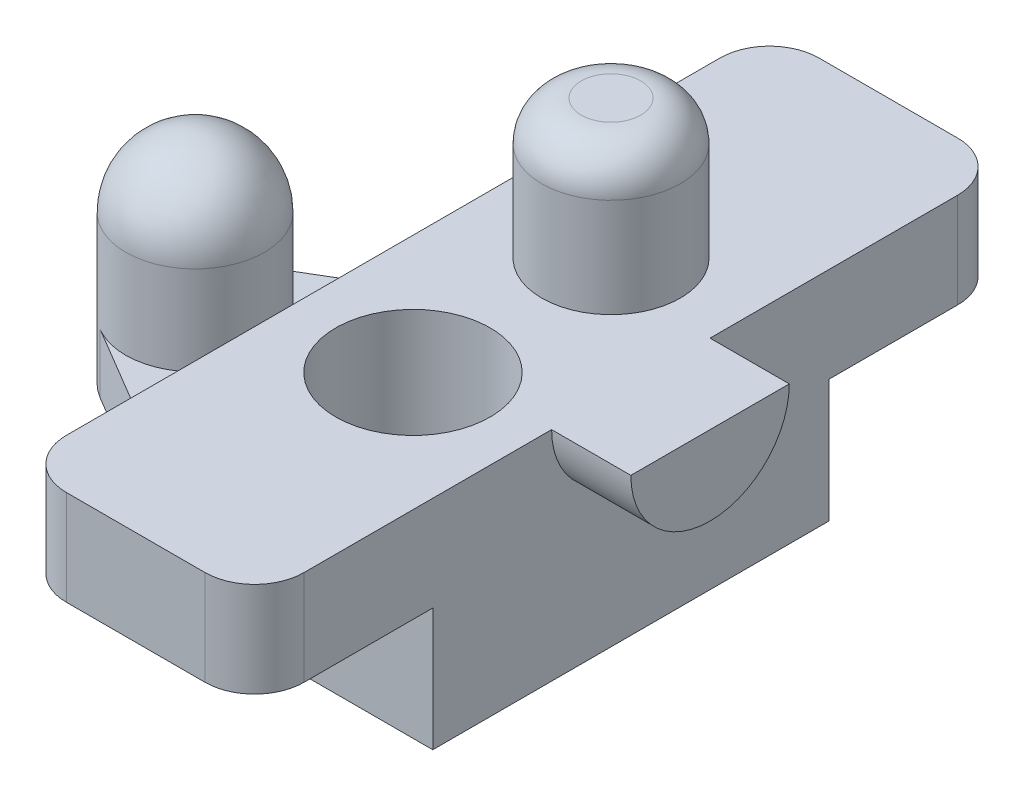
ISO-10303-21;
HEADER;
FILE_DESCRIPTION(('STEP AP214'),'2;1');
FILE_NAME('part.step','',(''),(''),'','','');
FILE_SCHEMA(('AUTOMOTIVE_DESIGN { 1 0 10303 214 1 1 1 1 }'));
ENDSEC;
DATA;
#1=APPLICATION_CONTEXT('core data for automotive mechanical design processes');
#2=APPLICATION_PROTOCOL_DEFINITION('international standard','automotive_design',2000,#1);
#3=PRODUCT_CONTEXT('',#1,'mechanical');
#4=PRODUCT('Part','Part','',(#3));
#5=PRODUCT_RELATED_PRODUCT_CATEGORY('part','',(#4));
#6=PRODUCT_DEFINITION_FORMATION('','',#4);
#7=PRODUCT_DEFINITION_CONTEXT('part definition',#1,'design');
#8=PRODUCT_DEFINITION('design','',#6,#7);
#9=PRODUCT_DEFINITION_SHAPE('','',#8);
#10=(LENGTH_UNIT() NAMED_UNIT(*) SI_UNIT(.MILLI.,.METRE.));
#11=(NAMED_UNIT(*) PLANE_ANGLE_UNIT() SI_UNIT($,.RADIAN.));
#12=(NAMED_UNIT(*) SI_UNIT($,.STERADIAN.) SOLID_ANGLE_UNIT());
#13=UNCERTAINTY_MEASURE_WITH_UNIT(LENGTH_MEASURE(1.E-05),#10,'distance_accuracy_value','');
#14=(GEOMETRIC_REPRESENTATION_CONTEXT(3) GLOBAL_UNCERTAINTY_ASSIGNED_CONTEXT((#13)) GLOBAL_UNIT_ASSIGNED_CONTEXT((#10,
#11,#12)) REPRESENTATION_CONTEXT('',''));
#15=CARTESIAN_POINT('',(0.,0.,0.));
#16=DIRECTION('',(0.,0.,1.));
#17=DIRECTION('',(1.,0.,0.));
#18=AXIS2_PLACEMENT_3D('',#15,#16,#17);
#19=CARTESIAN_POINT('',(11.,-1.5,-5.));
#20=DIRECTION('',(-1.,0.,0.));
#21=DIRECTION('',(0.,0.,1.));
#22=AXIS2_PLACEMENT_3D('',#19,#20,#21);
#23=PLANE('',#22);
#24=CARTESIAN_POINT('',(11.,4.,0.));
#25=DIRECTION('',(1.,0.,0.));
#26=DIRECTION('',(0.,0.,-1.));
#27=AXIS2_PLACEMENT_3D('',#24,#25,#26);
#28=CIRCLE('',#27,2.);
#29=CARTESIAN_POINT('',(11.,4.,2.));
#30=VERTEX_POINT('',#29);
#31=CARTESIAN_POINT('',(11.,4.,-2.));
#32=VERTEX_POINT('',#31);
#33=EDGE_CURVE('E59',#30,#32,#28,.T.);
#34=ORIENTED_EDGE('',*,*,#33,.F.);
#35=DIRECTION('',(0.,0.,-1.));
#36=VECTOR('',#35,1.);
#37=CARTESIAN_POINT('',(11.,4.,-5.));
#38=LINE('',#37,#36);
#39=CARTESIAN_POINT('',(11.,4.,8.25));
#40=VERTEX_POINT('',#39);
#41=EDGE_CURVE('E300',#40,#30,#38,.T.);
#42=ORIENTED_EDGE('',*,*,#41,.F.);
#43=DIRECTION('',(0.,1.,0.));
#44=VECTOR('',#43,1.);
#45=CARTESIAN_POINT('',(11.,1.6,8.25));
#46=LINE('',#45,#44);
#47=CARTESIAN_POINT('',(11.,1.6,8.25));
#48=VERTEX_POINT('',#47);
#49=EDGE_CURVE('E199',#48,#40,#46,.T.);
#50=ORIENTED_EDGE('',*,*,#49,.F.);
#51=DIRECTION('',(0.,0.,-1.));
#52=VECTOR('',#51,1.);
#53=CARTESIAN_POINT('',(11.,1.6,8.25));
#54=LINE('',#53,#52);
#55=CARTESIAN_POINT('',(11.,1.6,5.));
#56=VERTEX_POINT('',#55);
#57=EDGE_CURVE('E239',#48,#56,#54,.T.);
#58=ORIENTED_EDGE('',*,*,#57,.T.);
#59=DIRECTION('',(0.,1.,0.));
#60=VECTOR('',#59,1.);
#61=CARTESIAN_POINT('',(11.,-1.5,5.));
#62=LINE('',#61,#60);
#63=CARTESIAN_POINT('',(11.,-1.5,5.));
#64=VERTEX_POINT('',#63);
#65=EDGE_CURVE('E357',#64,#56,#62,.T.);
#66=ORIENTED_EDGE('',*,*,#65,.F.);
#67=DIRECTION('',(0.,0.,1.));
#68=VECTOR('',#67,1.);
#69=CARTESIAN_POINT('',(11.,-1.5,-5.));
#70=LINE('',#69,#68);
#71=CARTESIAN_POINT('',(11.,-1.5,-5.));
#72=VERTEX_POINT('',#71);
#73=EDGE_CURVE('E317',#72,#64,#70,.T.);
#74=ORIENTED_EDGE('',*,*,#73,.F.);
#75=DIRECTION('',(0.,1.,0.));
#76=VECTOR('',#75,1.);
#77=CARTESIAN_POINT('',(11.,-1.5,-5.));
#78=LINE('',#77,#76);
#79=CARTESIAN_POINT('',(11.,1.6,-5.));
#80=VERTEX_POINT('',#79);
#81=EDGE_CURVE('E361',#72,#80,#78,.T.);
#82=ORIENTED_EDGE('',*,*,#81,.T.);
#83=DIRECTION('',(0.,0.,-1.));
#84=VECTOR('',#83,1.);
#85=CARTESIAN_POINT('',(11.,1.6,-8.25));
#86=LINE('',#85,#84);
#87=CARTESIAN_POINT('',(11.,1.6,-8.25));
#88=VERTEX_POINT('',#87);
#89=EDGE_CURVE('E255',#80,#88,#86,.T.);
#90=ORIENTED_EDGE('',*,*,#89,.T.);
#91=DIRECTION('',(0.,1.,0.));
#92=VECTOR('',#91,1.);
#93=CARTESIAN_POINT('',(11.,1.6,-8.25));
#94=LINE('',#93,#92);
#95=CARTESIAN_POINT('',(11.,4.,-8.25));
#96=VERTEX_POINT('',#95);
#97=EDGE_CURVE('E271',#88,#96,#94,.T.);
#98=ORIENTED_EDGE('',*,*,#97,.T.);
#99=EDGE_CURVE('E299',#32,#96,#38,.T.);
#100=ORIENTED_EDGE('',*,*,#99,.F.);
#101=EDGE_LOOP('',(#34,#42,#50,#58,#66,#74,#82,#90,#98,#100));
#102=FACE_BOUND('',#101,.T.);
#103=ADVANCED_FACE('F43',(#102),#23,.F.);
#104=CARTESIAN_POINT('',(5.,-1.5,-5.));
#105=DIRECTION('',(0.,0.,1.));
#106=DIRECTION('',(1.,0.,0.));
#107=AXIS2_PLACEMENT_3D('',#104,#105,#106);
#108=PLANE('',#107);
#109=DIRECTION('',(0.,-1.,0.));
#110=VECTOR('',#109,1.);
#111=CARTESIAN_POINT('',(5.,4.,-5.));
#112=LINE('',#111,#110);
#113=CARTESIAN_POINT('',(5.,1.6,-5.));
#114=VERTEX_POINT('',#113);
#115=CARTESIAN_POINT('',(5.,0.,-5.));
#116=VERTEX_POINT('',#115);
#117=EDGE_CURVE('E303',#114,#116,#112,.T.);
#118=ORIENTED_EDGE('',*,*,#117,.F.);
#119=DIRECTION('',(1.,0.,0.));
#120=VECTOR('',#119,1.);
#121=CARTESIAN_POINT('',(5.,1.6,-5.));
#122=LINE('',#121,#120);
#123=EDGE_CURVE('E250',#114,#80,#122,.T.);
#124=ORIENTED_EDGE('',*,*,#123,.T.);
#125=ORIENTED_EDGE('',*,*,#81,.F.);
#126=DIRECTION('',(1.,0.,0.));
#127=VECTOR('',#126,1.);
#128=CARTESIAN_POINT('',(5.,-1.5,-5.));
#129=LINE('',#128,#127);
#130=CARTESIAN_POINT('',(5.,-1.5,-5.));
#131=VERTEX_POINT('',#130);
#132=EDGE_CURVE('E313',#131,#72,#129,.T.);
#133=ORIENTED_EDGE('',*,*,#132,.F.);
#134=DIRECTION('',(0.,1.,0.));
#135=VECTOR('',#134,1.);
#136=CARTESIAN_POINT('',(5.,-1.5,-5.));
#137=LINE('',#136,#135);
#138=EDGE_CURVE('E335',#131,#116,#137,.T.);
#139=ORIENTED_EDGE('',*,*,#138,.T.);
#140=EDGE_LOOP('',(#118,#124,#125,#133,#139));
#141=FACE_BOUND('',#140,.T.);
#142=ADVANCED_FACE('F391',(#141),#108,.F.);
#143=CARTESIAN_POINT('',(11.,-1.5,5.));
#144=DIRECTION('',(0.,0.,-1.));
#145=DIRECTION('',(-1.,0.,0.));
#146=AXIS2_PLACEMENT_3D('',#143,#144,#145);
#147=PLANE('',#146);
#148=ORIENTED_EDGE('',*,*,#65,.T.);
#149=DIRECTION('',(-1.,0.,0.));
#150=VECTOR('',#149,1.);
#151=CARTESIAN_POINT('',(5.,1.6,5.));
#152=LINE('',#151,#150);
#153=CARTESIAN_POINT('',(5.,1.6,5.));
#154=VERTEX_POINT('',#153);
#155=EDGE_CURVE('E236',#56,#154,#152,.T.);
#156=ORIENTED_EDGE('',*,*,#155,.T.);
#157=DIRECTION('',(0.,-1.,0.));
#158=VECTOR('',#157,1.);
#159=CARTESIAN_POINT('',(5.,4.,5.));
#160=LINE('',#159,#158);
#161=CARTESIAN_POINT('',(5.,0.,5.));
#162=VERTEX_POINT('',#161);
#163=EDGE_CURVE('E309',#154,#162,#160,.T.);
#164=ORIENTED_EDGE('',*,*,#163,.T.);
#165=DIRECTION('',(0.,1.,0.));
#166=VECTOR('',#165,1.);
#167=CARTESIAN_POINT('',(5.,-1.5,5.));
#168=LINE('',#167,#166);
#169=CARTESIAN_POINT('',(5.,-1.5,5.));
#170=VERTEX_POINT('',#169);
#171=EDGE_CURVE('E353',#170,#162,#168,.T.);
#172=ORIENTED_EDGE('',*,*,#171,.F.);
#173=DIRECTION('',(-1.,0.,0.));
#174=VECTOR('',#173,1.);
#175=CARTESIAN_POINT('',(11.,-1.5,5.));
#176=LINE('',#175,#174);
#177=EDGE_CURVE('E321',#64,#170,#176,.T.);
#178=ORIENTED_EDGE('',*,*,#177,.F.);
#179=EDGE_LOOP('',(#148,#156,#164,#172,#178));
#180=FACE_BOUND('',#179,.T.);
#181=ADVANCED_FACE('F397',(#180),#147,.F.);
#182=CARTESIAN_POINT('',(5.,-1.5,5.));
#183=DIRECTION('',(0.510109480302236,0.,-0.860109480302236));
#184=DIRECTION('',(-0.860109480302236,0.,-0.510109480302236));
#185=AXIS2_PLACEMENT_3D('',#182,#183,#184);
#186=PLANE('',#185);
#187=DIRECTION('',(-0.860109480302236,0.,-0.510109480302236));
#188=VECTOR('',#187,1.);
#189=CARTESIAN_POINT('',(5.,0.,5.));
#190=LINE('',#189,#188);
#191=CARTESIAN_POINT('',(-0.892691590528913,0.,1.50519159052891));
#192=VERTEX_POINT('',#191);
#193=EDGE_CURVE('E312',#162,#192,#190,.T.);
#194=ORIENTED_EDGE('',*,*,#193,.T.);
#195=DIRECTION('',(0.,1.,0.));
#196=VECTOR('',#195,1.);
#197=CARTESIAN_POINT('',(-0.892691590528913,-1.5,1.50519159052891));
#198=LINE('',#197,#196);
#199=CARTESIAN_POINT('',(-0.892691590528913,-1.5,1.50519159052891));
#200=VERTEX_POINT('',#199);
#201=EDGE_CURVE('E349',#200,#192,#198,.T.);
#202=ORIENTED_EDGE('',*,*,#201,.F.);
#203=DIRECTION('',(-0.860109480302236,0.,-0.510109480302236));
#204=VECTOR('',#203,1.);
#205=CARTESIAN_POINT('',(5.,-1.5,5.));
#206=LINE('',#205,#204);
#207=EDGE_CURVE('E324',#170,#200,#206,.T.);
#208=ORIENTED_EDGE('',*,*,#207,.F.);
#209=ORIENTED_EDGE('',*,*,#171,.T.);
#210=EDGE_LOOP('',(#194,#202,#208,#209));
#211=FACE_BOUND('',#210,.T.);
#212=ADVANCED_FACE('F420',(#211),#186,.F.);
#213=CARTESIAN_POINT('',(0.,-1.5,0.));
#214=DIRECTION('',(0.,1.,0.));
#215=DIRECTION('',(0.,0.,1.));
#216=AXIS2_PLACEMENT_3D('',#213,#214,#215);
#217=CYLINDRICAL_SURFACE('',#216,1.75);
#218=CARTESIAN_POINT('',(0.,2.25,0.));
#219=DIRECTION('',(0.,1.,0.));
#220=DIRECTION('',(0.,0.,1.));
#221=AXIS2_PLACEMENT_3D('',#218,#219,#220);
#222=CIRCLE('',#221,1.75);
#223=CARTESIAN_POINT('',(0.,2.25,1.75));
#224=VERTEX_POINT('',#223);
#225=EDGE_CURVE('E368',#224,#224,#222,.F.);
#226=ORIENTED_EDGE('',*,*,#225,.T.);
#227=EDGE_LOOP('',(#226));
#228=FACE_BOUND('',#227,.T.);
#229=ORIENTED_EDGE('',*,*,#201,.T.);
#230=CARTESIAN_POINT('',(0.,0.,0.));
#231=DIRECTION('',(0.,1.,0.));
#232=DIRECTION('',(0.,0.,1.));
#233=AXIS2_PLACEMENT_3D('',#230,#231,#232);
#234=CIRCLE('',#233,1.75);
#235=CARTESIAN_POINT('',(-0.892691590528913,0.,-1.50519159052891));
#236=VERTEX_POINT('',#235);
#237=EDGE_CURVE('E365',#236,#192,#234,.F.);
#238=ORIENTED_EDGE('',*,*,#237,.F.);
#239=DIRECTION('',(0.,1.,0.));
#240=VECTOR('',#239,1.);
#241=CARTESIAN_POINT('',(-0.892691590528913,-1.5,-1.50519159052891));
#242=LINE('',#241,#240);
#243=CARTESIAN_POINT('',(-0.892691590528913,-1.5,-1.50519159052891));
#244=VERTEX_POINT('',#243);
#245=EDGE_CURVE('E345',#244,#236,#242,.T.);
#246=ORIENTED_EDGE('',*,*,#245,.F.);
#247=CARTESIAN_POINT('',(0.,-1.5,0.));
#248=DIRECTION('',(0.,1.,0.));
#249=DIRECTION('',(0.,0.,1.));
#250=AXIS2_PLACEMENT_3D('',#247,#248,#249);
#251=CIRCLE('',#250,1.75);
#252=EDGE_CURVE('E327',#244,#200,#251,.T.);
#253=ORIENTED_EDGE('',*,*,#252,.T.);
#254=EDGE_LOOP('',(#229,#238,#246,#253));
#255=FACE_BOUND('',#254,.T.);
#256=ADVANCED_FACE('F416',(#228,#255),#217,.T.);
#257=CARTESIAN_POINT('',(5.,-1.5,-5.));
#258=DIRECTION('',(-0.510109480302236,0.,-0.860109480302236));
#259=DIRECTION('',(-0.860109480302236,0.,0.510109480302236));
#260=AXIS2_PLACEMENT_3D('',#257,#258,#259);
#261=PLANE('',#260);
#262=DIRECTION('',(-0.860109480302236,0.,0.510109480302236));
#263=VECTOR('',#262,1.);
#264=CARTESIAN_POINT('',(5.,0.,-5.));
#265=LINE('',#264,#263);
#266=EDGE_CURVE('E318',#116,#236,#265,.T.);
#267=ORIENTED_EDGE('',*,*,#266,.F.);
#268=ORIENTED_EDGE('',*,*,#138,.F.);
#269=DIRECTION('',(-0.860109480302236,0.,0.510109480302236));
#270=VECTOR('',#269,1.);
#271=CARTESIAN_POINT('',(5.,-1.5,-5.));
#272=LINE('',#271,#270);
#273=EDGE_CURVE('E331',#131,#244,#272,.T.);
#274=ORIENTED_EDGE('',*,*,#273,.T.);
#275=ORIENTED_EDGE('',*,*,#245,.T.);
#276=EDGE_LOOP('',(#267,#268,#274,#275));
#277=FACE_BOUND('',#276,.T.);
#278=ADVANCED_FACE('F419',(#277),#261,.T.);
#279=CARTESIAN_POINT('',(0.,-1.5,0.));
#280=DIRECTION('',(0.,1.,0.));
#281=DIRECTION('',(0.,0.,1.));
#282=AXIS2_PLACEMENT_3D('',#279,#280,#281);
#283=PLANE('',#282);
#284=ORIENTED_EDGE('',*,*,#132,.T.);
#285=ORIENTED_EDGE('',*,*,#73,.T.);
#286=ORIENTED_EDGE('',*,*,#177,.T.);
#287=ORIENTED_EDGE('',*,*,#207,.T.);
#288=ORIENTED_EDGE('',*,*,#252,.F.);
#289=ORIENTED_EDGE('',*,*,#273,.F.);
#290=EDGE_LOOP('',(#284,#285,#286,#287,#288,#289));
#291=FACE_BOUND('',#290,.T.);
#292=ADVANCED_FACE('F436',(#291),#283,.F.);
#293=CARTESIAN_POINT('',(0.,0.,0.));
#294=DIRECTION('',(0.,1.,0.));
#295=DIRECTION('',(0.,0.,1.));
#296=AXIS2_PLACEMENT_3D('',#293,#294,#295);
#297=PLANE('',#296);
#298=ORIENTED_EDGE('',*,*,#266,.T.);
#299=ORIENTED_EDGE('',*,*,#237,.T.);
#300=ORIENTED_EDGE('',*,*,#193,.F.);
#301=DIRECTION('',(0.,0.,1.));
#302=VECTOR('',#301,1.);
#303=CARTESIAN_POINT('',(5.,0.,-5.));
#304=LINE('',#303,#302);
#305=EDGE_CURVE('E286',#116,#162,#304,.T.);
#306=ORIENTED_EDGE('',*,*,#305,.F.);
#307=EDGE_LOOP('',(#298,#299,#300,#306));
#308=FACE_BOUND('',#307,.T.);
#309=ADVANCED_FACE('F430',(#308),#297,.T.);
#310=CARTESIAN_POINT('',(5.,4.,-5.));
#311=DIRECTION('',(1.,0.,0.));
#312=DIRECTION('',(0.,0.,-1.));
#313=AXIS2_PLACEMENT_3D('',#310,#311,#312);
#314=PLANE('',#313);
#315=ORIENTED_EDGE('',*,*,#305,.T.);
#316=ORIENTED_EDGE('',*,*,#163,.F.);
#317=DIRECTION('',(0.,0.,1.));
#318=VECTOR('',#317,1.);
#319=CARTESIAN_POINT('',(5.,1.6,5.));
#320=LINE('',#319,#318);
#321=CARTESIAN_POINT('',(5.,1.6,8.24999999999999));
#322=VERTEX_POINT('',#321);
#323=EDGE_CURVE('E67',#154,#322,#320,.T.);
#324=ORIENTED_EDGE('',*,*,#323,.T.);
#325=DIRECTION('',(0.,1.,0.));
#326=VECTOR('',#325,1.);
#327=CARTESIAN_POINT('',(5.,1.6,8.24999999999999));
#328=LINE('',#327,#326);
#329=CARTESIAN_POINT('',(5.,4.,8.24999999999999));
#330=VERTEX_POINT('',#329);
#331=EDGE_CURVE('E204',#322,#330,#328,.T.);
#332=ORIENTED_EDGE('',*,*,#331,.T.);
#333=DIRECTION('',(0.,0.,1.));
#334=VECTOR('',#333,1.);
#335=CARTESIAN_POINT('',(5.,4.,-5.));
#336=LINE('',#335,#334);
#337=CARTESIAN_POINT('',(5.,4.,-8.24999999999999));
#338=VERTEX_POINT('',#337);
#339=EDGE_CURVE('E296',#338,#330,#336,.T.);
#340=ORIENTED_EDGE('',*,*,#339,.F.);
#341=DIRECTION('',(0.,1.,0.));
#342=VECTOR('',#341,1.);
#343=CARTESIAN_POINT('',(5.,1.6,-8.24999999999999));
#344=LINE('',#343,#342);
#345=CARTESIAN_POINT('',(5.,1.6,-8.24999999999999));
#346=VERTEX_POINT('',#345);
#347=EDGE_CURVE('E282',#346,#338,#344,.T.);
#348=ORIENTED_EDGE('',*,*,#347,.F.);
#349=DIRECTION('',(0.,0.,1.));
#350=VECTOR('',#349,1.);
#351=CARTESIAN_POINT('',(5.,1.6,-5.));
#352=LINE('',#351,#350);
#353=EDGE_CURVE('E246',#346,#114,#352,.T.);
#354=ORIENTED_EDGE('',*,*,#353,.T.);
#355=ORIENTED_EDGE('',*,*,#117,.T.);
#356=EDGE_LOOP('',(#315,#316,#324,#332,#340,#348,#354,#355));
#357=FACE_BOUND('',#356,.T.);
#358=ADVANCED_FACE('F442',(#357),#314,.F.);
#359=CARTESIAN_POINT('',(0.,4.,0.));
#360=DIRECTION('',(0.,1.,0.));
#361=DIRECTION('',(0.,0.,1.));
#362=AXIS2_PLACEMENT_3D('',#359,#360,#361);
#363=PLANE('',#362);
#364=CARTESIAN_POINT('',(8.,4.,2.5));
#365=DIRECTION('',(0.,1.,0.));
#366=DIRECTION('',(0.,0.,1.));
#367=AXIS2_PLACEMENT_3D('',#364,#365,#366);
#368=CIRCLE('',#367,1.95);
#369=CARTESIAN_POINT('',(8.,4.,4.45));
#370=VERTEX_POINT('',#369);
#371=EDGE_CURVE('E181',#370,#370,#368,.T.);
#372=ORIENTED_EDGE('',*,*,#371,.F.);
#373=EDGE_LOOP('',(#372));
#374=FACE_BOUND('',#373,.T.);
#375=CARTESIAN_POINT('',(8.,4.,-2.5));
#376=DIRECTION('',(0.,1.,0.));
#377=DIRECTION('',(0.,0.,1.));
#378=AXIS2_PLACEMENT_3D('',#375,#376,#377);
#379=CIRCLE('',#378,1.75);
#380=CARTESIAN_POINT('',(8.,4.,-0.75));
#381=VERTEX_POINT('',#380);
#382=EDGE_CURVE('E193',#381,#381,#379,.T.);
#383=ORIENTED_EDGE('',*,*,#382,.F.);
#384=EDGE_LOOP('',(#383));
#385=FACE_BOUND('',#384,.T.);
#386=ORIENTED_EDGE('',*,*,#339,.T.);
#387=CARTESIAN_POINT('',(6.25,4.,8.25));
#388=DIRECTION('',(0.,1.,0.));
#389=DIRECTION('',(0.,0.,1.));
#390=AXIS2_PLACEMENT_3D('',#387,#388,#389);
#391=CIRCLE('',#390,1.25);
#392=CARTESIAN_POINT('',(6.25,4.,9.5));
#393=VERTEX_POINT('',#392);
#394=EDGE_CURVE('E217',#330,#393,#391,.T.);
#395=ORIENTED_EDGE('',*,*,#394,.T.);
#396=DIRECTION('',(1.,0.,0.));
#397=VECTOR('',#396,1.);
#398=CARTESIAN_POINT('',(6.25000000000001,4.,9.5));
#399=LINE('',#398,#397);
#400=CARTESIAN_POINT('',(9.75,4.,9.5));
#401=VERTEX_POINT('',#400);
#402=EDGE_CURVE('E213',#393,#401,#399,.T.);
#403=ORIENTED_EDGE('',*,*,#402,.T.);
#404=CARTESIAN_POINT('',(9.75,4.,8.25));
#405=DIRECTION('',(0.,1.,0.));
#406=DIRECTION('',(0.,0.,-1.));
#407=AXIS2_PLACEMENT_3D('',#404,#405,#406);
#408=CIRCLE('',#407,1.25);
#409=EDGE_CURVE('E222',#401,#40,#408,.T.);
#410=ORIENTED_EDGE('',*,*,#409,.T.);
#411=ORIENTED_EDGE('',*,*,#41,.T.);
#412=DIRECTION('',(-1.,0.,0.));
#413=VECTOR('',#412,1.);
#414=CARTESIAN_POINT('',(13.,4.,2.));
#415=LINE('',#414,#413);
#416=CARTESIAN_POINT('',(13.,4.,2.));
#417=VERTEX_POINT('',#416);
#418=EDGE_CURVE('E170',#417,#30,#415,.T.);
#419=ORIENTED_EDGE('',*,*,#418,.F.);
#420=DIRECTION('',(0.,0.,1.));
#421=VECTOR('',#420,1.);
#422=CARTESIAN_POINT('',(13.,4.,2.));
#423=LINE('',#422,#421);
#424=CARTESIAN_POINT('',(13.,4.,-2.));
#425=VERTEX_POINT('',#424);
#426=EDGE_CURVE('E164',#425,#417,#423,.T.);
#427=ORIENTED_EDGE('',*,*,#426,.F.);
#428=DIRECTION('',(-1.,0.,0.));
#429=VECTOR('',#428,1.);
#430=CARTESIAN_POINT('',(13.,4.,-2.));
#431=LINE('',#430,#429);
#432=EDGE_CURVE('E167',#425,#32,#431,.T.);
#433=ORIENTED_EDGE('',*,*,#432,.T.);
#434=ORIENTED_EDGE('',*,*,#99,.T.);
#435=CARTESIAN_POINT('',(9.75,4.,-8.25));
#436=DIRECTION('',(0.,1.,0.));
#437=DIRECTION('',(0.,0.,1.));
#438=AXIS2_PLACEMENT_3D('',#435,#436,#437);
#439=CIRCLE('',#438,1.25);
#440=CARTESIAN_POINT('',(9.75,4.,-9.5));
#441=VERTEX_POINT('',#440);
#442=EDGE_CURVE('E226',#96,#441,#439,.T.);
#443=ORIENTED_EDGE('',*,*,#442,.T.);
#444=DIRECTION('',(-1.,0.,0.));
#445=VECTOR('',#444,1.);
#446=CARTESIAN_POINT('',(6.25000000000001,4.,-9.5));
#447=LINE('',#446,#445);
#448=CARTESIAN_POINT('',(6.25000000000001,4.,-9.5));
#449=VERTEX_POINT('',#448);
#450=EDGE_CURVE('E275',#441,#449,#447,.T.);
#451=ORIENTED_EDGE('',*,*,#450,.T.);
#452=CARTESIAN_POINT('',(6.25,4.,-8.25));
#453=DIRECTION('',(0.,1.,0.));
#454=DIRECTION('',(0.,0.,-1.));
#455=AXIS2_PLACEMENT_3D('',#452,#453,#454);
#456=CIRCLE('',#455,1.25);
#457=EDGE_CURVE('E251',#449,#338,#456,.T.);
#458=ORIENTED_EDGE('',*,*,#457,.T.);
#459=EDGE_LOOP('',(#386,#395,#403,#410,#411,#419,#427,#433,#434,#443,#451,#458));
#460=FACE_BOUND('',#459,.T.);
#461=ADVANCED_FACE('F166',(#374,#385,#460),#363,.T.);
#462=CARTESIAN_POINT('',(6.25,1.6,-8.25));
#463=DIRECTION('',(0.,1.,0.));
#464=DIRECTION('',(0.,0.,1.));
#465=AXIS2_PLACEMENT_3D('',#462,#463,#464);
#466=CYLINDRICAL_SURFACE('',#465,1.25);
#467=ORIENTED_EDGE('',*,*,#457,.F.);
#468=DIRECTION('',(0.,1.,0.));
#469=VECTOR('',#468,1.);
#470=CARTESIAN_POINT('',(6.25000000000001,1.6,-9.5));
#471=LINE('',#470,#469);
#472=CARTESIAN_POINT('',(6.25000000000001,1.6,-9.5));
#473=VERTEX_POINT('',#472);
#474=EDGE_CURVE('E287',#473,#449,#471,.T.);
#475=ORIENTED_EDGE('',*,*,#474,.F.);
#476=CARTESIAN_POINT('',(6.25,1.6,-8.25));
#477=DIRECTION('',(0.,1.,0.));
#478=DIRECTION('',(0.,0.,-1.));
#479=AXIS2_PLACEMENT_3D('',#476,#477,#478);
#480=CIRCLE('',#479,1.25);
#481=EDGE_CURVE('E267',#473,#346,#480,.T.);
#482=ORIENTED_EDGE('',*,*,#481,.T.);
#483=ORIENTED_EDGE('',*,*,#347,.T.);
#484=EDGE_LOOP('',(#467,#475,#482,#483));
#485=FACE_BOUND('',#484,.T.);
#486=ADVANCED_FACE('F459',(#485),#466,.T.);
#487=CARTESIAN_POINT('',(6.25000000000001,1.6,-9.5));
#488=DIRECTION('',(0.,0.,-1.));
#489=DIRECTION('',(-1.,0.,0.));
#490=AXIS2_PLACEMENT_3D('',#487,#488,#489);
#491=PLANE('',#490);
#492=ORIENTED_EDGE('',*,*,#450,.F.);
#493=DIRECTION('',(0.,1.,0.));
#494=VECTOR('',#493,1.);
#495=CARTESIAN_POINT('',(9.75,1.6,-9.5));
#496=LINE('',#495,#494);
#497=CARTESIAN_POINT('',(9.75,1.6,-9.5));
#498=VERTEX_POINT('',#497);
#499=EDGE_CURVE('E290',#498,#441,#496,.T.);
#500=ORIENTED_EDGE('',*,*,#499,.F.);
#501=DIRECTION('',(-1.,0.,0.));
#502=VECTOR('',#501,1.);
#503=CARTESIAN_POINT('',(6.25000000000001,1.6,-9.5));
#504=LINE('',#503,#502);
#505=EDGE_CURVE('E263',#498,#473,#504,.T.);
#506=ORIENTED_EDGE('',*,*,#505,.T.);
#507=ORIENTED_EDGE('',*,*,#474,.T.);
#508=EDGE_LOOP('',(#492,#500,#506,#507));
#509=FACE_BOUND('',#508,.T.);
#510=ADVANCED_FACE('F464',(#509),#491,.T.);
#511=CARTESIAN_POINT('',(9.75,1.6,-8.25));
#512=DIRECTION('',(0.,1.,0.));
#513=DIRECTION('',(0.,0.,1.));
#514=AXIS2_PLACEMENT_3D('',#511,#512,#513);
#515=CYLINDRICAL_SURFACE('',#514,1.25);
#516=ORIENTED_EDGE('',*,*,#442,.F.);
#517=ORIENTED_EDGE('',*,*,#97,.F.);
#518=CARTESIAN_POINT('',(9.75,1.6,-8.25));
#519=DIRECTION('',(0.,1.,0.));
#520=DIRECTION('',(0.,0.,1.));
#521=AXIS2_PLACEMENT_3D('',#518,#519,#520);
#522=CIRCLE('',#521,1.25);
#523=EDGE_CURVE('E259',#88,#498,#522,.T.);
#524=ORIENTED_EDGE('',*,*,#523,.T.);
#525=ORIENTED_EDGE('',*,*,#499,.T.);
#526=EDGE_LOOP('',(#516,#517,#524,#525));
#527=FACE_BOUND('',#526,.T.);
#528=ADVANCED_FACE('F470',(#527),#515,.T.);
#529=CARTESIAN_POINT('',(6.25,1.6,-8.25));
#530=DIRECTION('',(0.,-1.,0.));
#531=DIRECTION('',(0.,0.,-1.));
#532=AXIS2_PLACEMENT_3D('',#529,#530,#531);
#533=PLANE('',#532);
#534=ORIENTED_EDGE('',*,*,#353,.F.);
#535=ORIENTED_EDGE('',*,*,#481,.F.);
#536=ORIENTED_EDGE('',*,*,#505,.F.);
#537=ORIENTED_EDGE('',*,*,#523,.F.);
#538=ORIENTED_EDGE('',*,*,#89,.F.);
#539=ORIENTED_EDGE('',*,*,#123,.F.);
#540=EDGE_LOOP('',(#534,#535,#536,#537,#538,#539));
#541=FACE_BOUND('',#540,.T.);
#542=ADVANCED_FACE('F468',(#541),#533,.T.);
#543=CARTESIAN_POINT('',(9.75,1.6,8.25));
#544=DIRECTION('',(0.,1.,0.));
#545=DIRECTION('',(0.,0.,1.));
#546=AXIS2_PLACEMENT_3D('',#543,#544,#545);
#547=CYLINDRICAL_SURFACE('',#546,1.25);
#548=ORIENTED_EDGE('',*,*,#409,.F.);
#549=DIRECTION('',(0.,1.,0.));
#550=VECTOR('',#549,1.);
#551=CARTESIAN_POINT('',(9.75,1.6,9.5));
#552=LINE('',#551,#550);
#553=CARTESIAN_POINT('',(9.75,1.6,9.5));
#554=VERTEX_POINT('',#553);
#555=EDGE_CURVE('E198',#554,#401,#552,.T.);
#556=ORIENTED_EDGE('',*,*,#555,.F.);
#557=CARTESIAN_POINT('',(9.75,1.6,8.25));
#558=DIRECTION('',(0.,1.,0.));
#559=DIRECTION('',(0.,0.,-1.));
#560=AXIS2_PLACEMENT_3D('',#557,#558,#559);
#561=CIRCLE('',#560,1.25);
#562=EDGE_CURVE('E218',#554,#48,#561,.T.);
#563=ORIENTED_EDGE('',*,*,#562,.T.);
#564=ORIENTED_EDGE('',*,*,#49,.T.);
#565=EDGE_LOOP('',(#548,#556,#563,#564));
#566=FACE_BOUND('',#565,.T.);
#567=ADVANCED_FACE('F451',(#566),#547,.T.);
#568=CARTESIAN_POINT('',(6.25000000000001,1.6,9.5));
#569=DIRECTION('',(0.,0.,1.));
#570=DIRECTION('',(1.,0.,0.));
#571=AXIS2_PLACEMENT_3D('',#568,#569,#570);
#572=PLANE('',#571);
#573=ORIENTED_EDGE('',*,*,#402,.F.);
#574=DIRECTION('',(0.,1.,0.));
#575=VECTOR('',#574,1.);
#576=CARTESIAN_POINT('',(6.25,1.6,9.5));
#577=LINE('',#576,#575);
#578=CARTESIAN_POINT('',(6.25,1.6,9.5));
#579=VERTEX_POINT('',#578);
#580=EDGE_CURVE('E208',#579,#393,#577,.T.);
#581=ORIENTED_EDGE('',*,*,#580,.F.);
#582=DIRECTION('',(1.,0.,0.));
#583=VECTOR('',#582,1.);
#584=CARTESIAN_POINT('',(6.25000000000001,1.6,9.5));
#585=LINE('',#584,#583);
#586=EDGE_CURVE('E203',#579,#554,#585,.T.);
#587=ORIENTED_EDGE('',*,*,#586,.T.);
#588=ORIENTED_EDGE('',*,*,#555,.T.);
#589=EDGE_LOOP('',(#573,#581,#587,#588));
#590=FACE_BOUND('',#589,.T.);
#591=ADVANCED_FACE('F454',(#590),#572,.T.);
#592=CARTESIAN_POINT('',(6.25,1.6,8.25));
#593=DIRECTION('',(0.,1.,0.));
#594=DIRECTION('',(0.,0.,1.));
#595=AXIS2_PLACEMENT_3D('',#592,#593,#594);
#596=CYLINDRICAL_SURFACE('',#595,1.25);
#597=ORIENTED_EDGE('',*,*,#394,.F.);
#598=ORIENTED_EDGE('',*,*,#331,.F.);
#599=CARTESIAN_POINT('',(6.25,1.6,8.25));
#600=DIRECTION('',(0.,1.,0.));
#601=DIRECTION('',(0.,0.,1.));
#602=AXIS2_PLACEMENT_3D('',#599,#600,#601);
#603=CIRCLE('',#602,1.25);
#604=EDGE_CURVE('E230',#322,#579,#603,.T.);
#605=ORIENTED_EDGE('',*,*,#604,.T.);
#606=ORIENTED_EDGE('',*,*,#580,.T.);
#607=EDGE_LOOP('',(#597,#598,#605,#606));
#608=FACE_BOUND('',#607,.T.);
#609=ADVANCED_FACE('F412',(#608),#596,.T.);
#610=CARTESIAN_POINT('',(9.75,1.6,8.25));
#611=DIRECTION('',(0.,-1.,0.));
#612=DIRECTION('',(0.,0.,-1.));
#613=AXIS2_PLACEMENT_3D('',#610,#611,#612);
#614=PLANE('',#613);
#615=ORIENTED_EDGE('',*,*,#562,.F.);
#616=ORIENTED_EDGE('',*,*,#586,.F.);
#617=ORIENTED_EDGE('',*,*,#604,.F.);
#618=ORIENTED_EDGE('',*,*,#323,.F.);
#619=ORIENTED_EDGE('',*,*,#155,.F.);
#620=ORIENTED_EDGE('',*,*,#57,.F.);
#621=EDGE_LOOP('',(#615,#616,#617,#618,#619,#620));
#622=FACE_BOUND('',#621,.T.);
#623=ADVANCED_FACE('F404',(#622),#614,.T.);
#624=CARTESIAN_POINT('',(0.,2.25,0.));
#625=DIRECTION('',(0.,1.,0.));
#626=DIRECTION('',(0.,0.,1.));
#627=AXIS2_PLACEMENT_3D('',#624,#625,#626);
#628=SPHERICAL_SURFACE('',#627,1.75);
#629=ORIENTED_EDGE('',*,*,#225,.F.);
#630=EDGE_LOOP('',(#629));
#631=FACE_BOUND('',#630,.T.);
#632=ADVANCED_FACE('F402',(#631),#628,.T.);
#633=CARTESIAN_POINT('',(8.,7.5,-2.5));
#634=DIRECTION('',(0.,-1.,0.));
#635=DIRECTION('',(0.,0.,-1.));
#636=AXIS2_PLACEMENT_3D('',#633,#634,#635);
#637=CYLINDRICAL_SURFACE('',#636,1.75);
#638=CARTESIAN_POINT('',(8.,6.5,-2.5));
#639=DIRECTION('',(0.,1.,0.));
#640=DIRECTION('',(0.,0.,1.));
#641=AXIS2_PLACEMENT_3D('',#638,#639,#640);
#642=CIRCLE('',#641,1.75);
#643=CARTESIAN_POINT('',(8.,6.5,-0.75));
#644=VERTEX_POINT('',#643);
#645=EDGE_CURVE('E11',#644,#644,#642,.F.);
#646=ORIENTED_EDGE('',*,*,#645,.T.);
#647=EDGE_LOOP('',(#646));
#648=FACE_BOUND('',#647,.T.);
#649=ORIENTED_EDGE('',*,*,#382,.T.);
#650=EDGE_LOOP('',(#649));
#651=FACE_BOUND('',#650,.T.);
#652=ADVANCED_FACE('F387',(#648,#651),#637,.T.);
#653=CARTESIAN_POINT('',(8.,7.5,-2.5));
#654=DIRECTION('',(0.,1.,0.));
#655=DIRECTION('',(0.,0.,1.));
#656=AXIS2_PLACEMENT_3D('',#653,#654,#655);
#657=PLANE('',#656);
#658=CARTESIAN_POINT('',(8.,7.5,-2.5));
#659=DIRECTION('',(0.,1.,0.));
#660=DIRECTION('',(0.,0.,1.));
#661=AXIS2_PLACEMENT_3D('',#658,#659,#660);
#662=CIRCLE('',#661,0.75);
#663=CARTESIAN_POINT('',(8.,7.5,-1.75));
#664=VERTEX_POINT('',#663);
#665=EDGE_CURVE('E52',#664,#664,#662,.T.);
#666=ORIENTED_EDGE('',*,*,#665,.T.);
#667=EDGE_LOOP('',(#666));
#668=FACE_BOUND('',#667,.T.);
#669=ADVANCED_FACE('F375',(#668),#657,.T.);
#670=CARTESIAN_POINT('',(8.,6.5,-2.5));
#671=DIRECTION('',(0.,1.,0.));
#672=DIRECTION('',(0.,0.,1.));
#673=AXIS2_PLACEMENT_3D('',#670,#671,#672);
#674=DEGENERATE_TOROIDAL_SURFACE('',#673,0.75,1.,.T.);
#675=ORIENTED_EDGE('',*,*,#645,.F.);
#676=EDGE_LOOP('',(#675));
#677=FACE_BOUND('',#676,.T.);
#678=ORIENTED_EDGE('',*,*,#665,.F.);
#679=EDGE_LOOP('',(#678));
#680=FACE_BOUND('',#679,.T.);
#681=ADVANCED_FACE('F45',(#677,#680),#674,.T.);
#682=CARTESIAN_POINT('',(8.,0.25,2.5));
#683=DIRECTION('',(0.,1.,0.));
#684=DIRECTION('',(0.,0.,1.));
#685=AXIS2_PLACEMENT_3D('',#682,#683,#684);
#686=CYLINDRICAL_SURFACE('',#685,1.95);
#687=CARTESIAN_POINT('',(8.,0.25,2.5));
#688=DIRECTION('',(0.,1.,0.));
#689=DIRECTION('',(0.,0.,1.));
#690=AXIS2_PLACEMENT_3D('',#687,#688,#689);
#691=CIRCLE('',#690,1.95);
#692=CARTESIAN_POINT('',(8.,0.25,4.45));
#693=VERTEX_POINT('',#692);
#694=EDGE_CURVE('E186',#693,#693,#691,.T.);
#695=ORIENTED_EDGE('',*,*,#694,.F.);
#696=EDGE_LOOP('',(#695));
#697=FACE_BOUND('',#696,.T.);
#698=ORIENTED_EDGE('',*,*,#371,.T.);
#699=EDGE_LOOP('',(#698));
#700=FACE_BOUND('',#699,.T.);
#701=ADVANCED_FACE('F378',(#697,#700),#686,.F.);
#702=CARTESIAN_POINT('',(8.,0.25,2.5));
#703=DIRECTION('',(0.,1.,0.));
#704=DIRECTION('',(0.,0.,1.));
#705=AXIS2_PLACEMENT_3D('',#702,#703,#704);
#706=PLANE('',#705);
#707=ORIENTED_EDGE('',*,*,#694,.T.);
#708=EDGE_LOOP('',(#707));
#709=FACE_BOUND('',#708,.T.);
#710=ADVANCED_FACE('F384',(#709),#706,.T.);
#711=CARTESIAN_POINT('',(13.,4.,0.));
#712=DIRECTION('',(-1.,0.,0.));
#713=DIRECTION('',(0.,0.,1.));
#714=AXIS2_PLACEMENT_3D('',#711,#712,#713);
#715=CYLINDRICAL_SURFACE('',#714,2.);
#716=ORIENTED_EDGE('',*,*,#33,.T.);
#717=ORIENTED_EDGE('',*,*,#432,.F.);
#718=CARTESIAN_POINT('',(13.,4.,0.));
#719=DIRECTION('',(1.,0.,0.));
#720=DIRECTION('',(0.,0.,-1.));
#721=AXIS2_PLACEMENT_3D('',#718,#719,#720);
#722=CIRCLE('',#721,2.);
#723=EDGE_CURVE('E174',#417,#425,#722,.T.);
#724=ORIENTED_EDGE('',*,*,#723,.F.);
#725=ORIENTED_EDGE('',*,*,#418,.T.);
#726=EDGE_LOOP('',(#716,#717,#724,#725));
#727=FACE_BOUND('',#726,.T.);
#728=ADVANCED_FACE('F179',(#727),#715,.T.);
#729=CARTESIAN_POINT('',(13.,4.,0.));
#730=DIRECTION('',(1.,0.,0.));
#731=DIRECTION('',(0.,0.,-1.));
#732=AXIS2_PLACEMENT_3D('',#729,#730,#731);
#733=PLANE('',#732);
#734=ORIENTED_EDGE('',*,*,#723,.T.);
#735=ORIENTED_EDGE('',*,*,#426,.T.);
#736=EDGE_LOOP('',(#734,#735));
#737=FACE_BOUND('',#736,.T.);
#738=ADVANCED_FACE('F176',(#737),#733,.T.);
#739=CLOSED_SHELL('',(#103,#142,#181,#212,#256,#278,#292,#309,#358,#461,#486,#510,#528,#542,
#567,#591,#609,#623,#632,#652,#669,#681,#701,#710,#728,#738));
#740=MANIFOLD_SOLID_BREP('B2',#739);
#741=ADVANCED_BREP_SHAPE_REPRESENTATION('',(#18,#740),#14);
#742=SHAPE_DEFINITION_REPRESENTATION(#9,#741);
ENDSEC;
END-ISO-10303-21;
